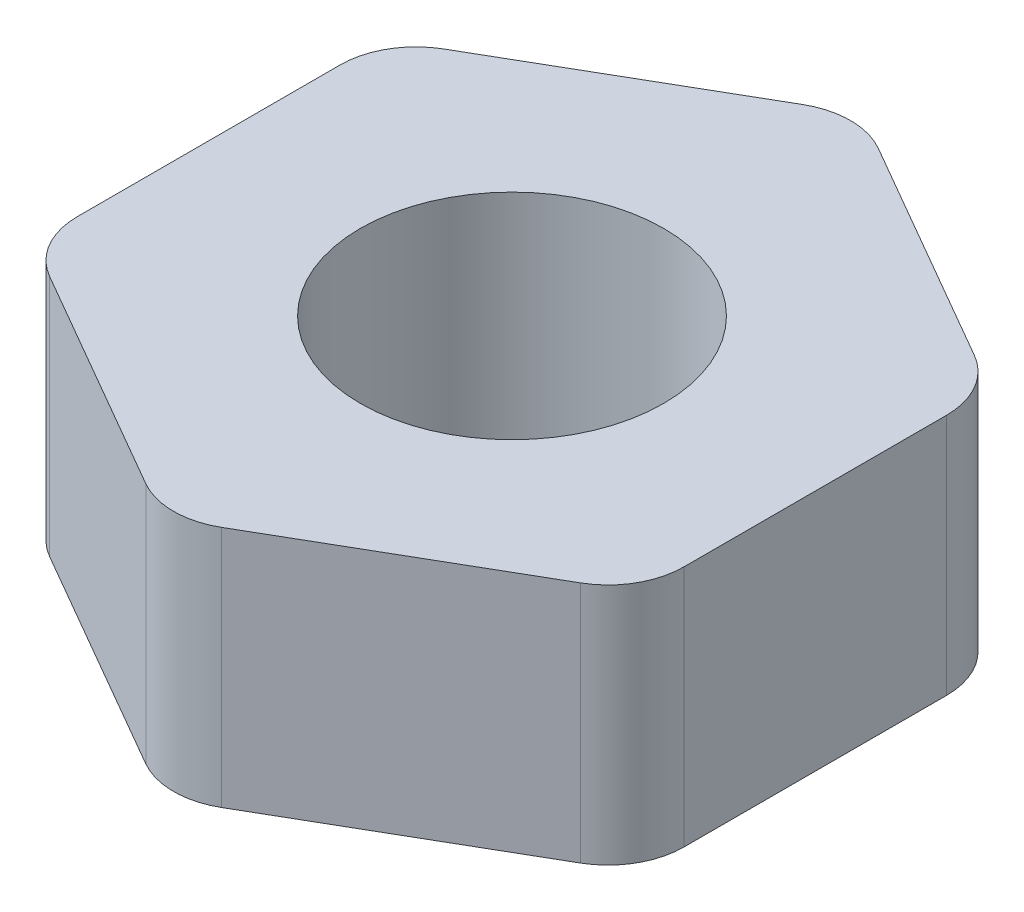
ISO-10303-21;
HEADER;
FILE_DESCRIPTION(('STEP AP214'),'2;1');
FILE_NAME('part.step','',(''),(''),'','','');
FILE_SCHEMA(('AUTOMOTIVE_DESIGN { 1 0 10303 214 1 1 1 1 }'));
ENDSEC;
DATA;
#1=APPLICATION_CONTEXT('core data for automotive mechanical design processes');
#2=APPLICATION_PROTOCOL_DEFINITION('international standard','automotive_design',2000,#1);
#3=PRODUCT_CONTEXT('',#1,'mechanical');
#4=PRODUCT('Part','Part','',(#3));
#5=PRODUCT_RELATED_PRODUCT_CATEGORY('part','',(#4));
#6=PRODUCT_DEFINITION_FORMATION('','',#4);
#7=PRODUCT_DEFINITION_CONTEXT('part definition',#1,'design');
#8=PRODUCT_DEFINITION('design','',#6,#7);
#9=PRODUCT_DEFINITION_SHAPE('','',#8);
#10=(LENGTH_UNIT() NAMED_UNIT(*) SI_UNIT(.MILLI.,.METRE.));
#11=(NAMED_UNIT(*) PLANE_ANGLE_UNIT() SI_UNIT($,.RADIAN.));
#12=(NAMED_UNIT(*) SI_UNIT($,.STERADIAN.) SOLID_ANGLE_UNIT());
#13=UNCERTAINTY_MEASURE_WITH_UNIT(LENGTH_MEASURE(1.E-05),#10,'distance_accuracy_value','');
#14=(GEOMETRIC_REPRESENTATION_CONTEXT(3) GLOBAL_UNCERTAINTY_ASSIGNED_CONTEXT((#13)) GLOBAL_UNIT_ASSIGNED_CONTEXT((#10,
#11,#12)) REPRESENTATION_CONTEXT('',''));
#15=CARTESIAN_POINT('',(0.,0.,0.));
#16=DIRECTION('',(0.,0.,1.));
#17=DIRECTION('',(1.,0.,0.));
#18=AXIS2_PLACEMENT_3D('',#15,#16,#17);
#19=CARTESIAN_POINT('',(0.,1.6,0.));
#20=DIRECTION('',(0.,1.,0.));
#21=DIRECTION('',(0.,0.,1.));
#22=AXIS2_PLACEMENT_3D('',#19,#20,#21);
#23=PLANE('',#22);
#24=DIRECTION('',(0.866025403784442,0.,0.499999999999995));
#25=VECTOR('',#24,1.);
#26=CARTESIAN_POINT('',(-2.,1.6,1.15470053837926));
#27=LINE('',#26,#25);
#28=CARTESIAN_POINT('',(-1.74999999999999,1.6,1.29903810567667));
#29=VERTEX_POINT('',#28);
#30=CARTESIAN_POINT('',(-0.249999999999985,1.6,2.1650635094611));
#31=VERTEX_POINT('',#30);
#32=EDGE_CURVE('E252',#29,#31,#27,.T.);
#33=ORIENTED_EDGE('',*,*,#32,.T.);
#34=CARTESIAN_POINT('',(0.,1.6,1.73205080756888));
#35=DIRECTION('',(0.,1.,0.));
#36=DIRECTION('',(0.,0.,1.));
#37=AXIS2_PLACEMENT_3D('',#34,#35,#36);
#38=CIRCLE('',#37,0.5);
#39=CARTESIAN_POINT('',(0.250000000000015,1.6,2.1650635094611));
#40=VERTEX_POINT('',#39);
#41=EDGE_CURVE('E212',#31,#40,#38,.T.);
#42=ORIENTED_EDGE('',*,*,#41,.T.);
#43=DIRECTION('',(0.866025403784435,0.,-0.500000000000007));
#44=VECTOR('',#43,1.);
#45=CARTESIAN_POINT('',(0.,1.6,2.3094010767585));
#46=LINE('',#45,#44);
#47=CARTESIAN_POINT('',(1.75000000000001,1.6,1.29903810567664));
#48=VERTEX_POINT('',#47);
#49=EDGE_CURVE('E157',#40,#48,#46,.T.);
#50=ORIENTED_EDGE('',*,*,#49,.T.);
#51=CARTESIAN_POINT('',(1.50000000000001,1.6,0.866025403784425));
#52=DIRECTION('',(0.,1.,0.));
#53=DIRECTION('',(0.,0.,1.));
#54=AXIS2_PLACEMENT_3D('',#51,#52,#53);
#55=CIRCLE('',#54,0.5);
#56=CARTESIAN_POINT('',(2.00000000000001,1.6,0.86602540378442));
#57=VERTEX_POINT('',#56);
#58=EDGE_CURVE('E68',#48,#57,#55,.T.);
#59=ORIENTED_EDGE('',*,*,#58,.T.);
#60=DIRECTION('',(0.,0.,-1.));
#61=VECTOR('',#60,1.);
#62=CARTESIAN_POINT('',(2.00000000000001,1.6,1.15470053837923));
#63=LINE('',#62,#61);
#64=CARTESIAN_POINT('',(1.99999999999999,1.6,-0.866025403784464));
#65=VERTEX_POINT('',#64);
#66=EDGE_CURVE('E178',#57,#65,#63,.T.);
#67=ORIENTED_EDGE('',*,*,#66,.T.);
#68=CARTESIAN_POINT('',(1.49999999999999,1.6,-0.866025403784459));
#69=DIRECTION('',(0.,1.,0.));
#70=DIRECTION('',(0.,0.,1.));
#71=AXIS2_PLACEMENT_3D('',#68,#69,#70);
#72=CIRCLE('',#71,0.5);
#73=CARTESIAN_POINT('',(1.74999999999999,1.6,-1.29903810567668));
#74=VERTEX_POINT('',#73);
#75=EDGE_CURVE('E204',#65,#74,#72,.T.);
#76=ORIENTED_EDGE('',*,*,#75,.T.);
#77=DIRECTION('',(-0.866025403784442,0.,-0.499999999999995));
#78=VECTOR('',#77,1.);
#79=CARTESIAN_POINT('',(1.99999999999999,1.6,-1.15470053837928));
#80=LINE('',#79,#78);
#81=CARTESIAN_POINT('',(0.249999999999999,1.6,-2.1650635094611));
#82=VERTEX_POINT('',#81);
#83=EDGE_CURVE('E171',#74,#82,#80,.T.);
#84=ORIENTED_EDGE('',*,*,#83,.T.);
#85=CARTESIAN_POINT('',(0.,1.6,-1.73205080756888));
#86=DIRECTION('',(0.,1.,0.));
#87=DIRECTION('',(0.,0.,1.));
#88=AXIS2_PLACEMENT_3D('',#85,#86,#87);
#89=CIRCLE('',#88,0.5);
#90=CARTESIAN_POINT('',(-0.249999999999999,1.6,-2.1650635094611));
#91=VERTEX_POINT('',#90);
#92=EDGE_CURVE('E207',#82,#91,#89,.T.);
#93=ORIENTED_EDGE('',*,*,#92,.T.);
#94=DIRECTION('',(-0.866025403784438,0.,0.500000000000001));
#95=VECTOR('',#94,1.);
#96=CARTESIAN_POINT('',(0.,1.6,-2.3094010767585));
#97=LINE('',#96,#95);
#98=CARTESIAN_POINT('',(-1.75,1.6,-1.29903810567665));
#99=VERTEX_POINT('',#98);
#100=EDGE_CURVE('E253',#91,#99,#97,.T.);
#101=ORIENTED_EDGE('',*,*,#100,.T.);
#102=CARTESIAN_POINT('',(-1.5,1.6,-0.866025403784436));
#103=DIRECTION('',(0.,1.,0.));
#104=DIRECTION('',(0.,0.,1.));
#105=AXIS2_PLACEMENT_3D('',#102,#103,#104);
#106=CIRCLE('',#105,0.5);
#107=CARTESIAN_POINT('',(-2.,1.6,-0.866025403784434));
#108=VERTEX_POINT('',#107);
#109=EDGE_CURVE('E201',#99,#108,#106,.T.);
#110=ORIENTED_EDGE('',*,*,#109,.T.);
#111=DIRECTION('',(0.,0.,1.));
#112=VECTOR('',#111,1.);
#113=CARTESIAN_POINT('',(-2.,1.6,-1.15470053837925));
#114=LINE('',#113,#112);
#115=CARTESIAN_POINT('',(-2.,1.6,0.866025403784448));
#116=VERTEX_POINT('',#115);
#117=EDGE_CURVE('E241',#108,#116,#114,.T.);
#118=ORIENTED_EDGE('',*,*,#117,.T.);
#119=CARTESIAN_POINT('',(-1.5,1.6,0.866025403784446));
#120=DIRECTION('',(0.,1.,0.));
#121=DIRECTION('',(0.,0.,1.));
#122=AXIS2_PLACEMENT_3D('',#119,#120,#121);
#123=CIRCLE('',#122,0.5);
#124=EDGE_CURVE('E198',#116,#29,#123,.T.);
#125=ORIENTED_EDGE('',*,*,#124,.T.);
#126=EDGE_LOOP('',(#33,#42,#50,#59,#67,#76,#84,#93,#101,#110,#118,#125));
#127=FACE_BOUND('',#126,.T.);
#128=CARTESIAN_POINT('',(0.,1.6,0.));
#129=DIRECTION('',(0.,1.,0.));
#130=DIRECTION('',(0.,0.,1.));
#131=AXIS2_PLACEMENT_3D('',#128,#129,#130);
#132=CIRCLE('',#131,1.);
#133=CARTESIAN_POINT('',(0.,1.6,1.));
#134=VERTEX_POINT('',#133);
#135=EDGE_CURVE('E269',#134,#134,#132,.T.);
#136=ORIENTED_EDGE('',*,*,#135,.F.);
#137=EDGE_LOOP('',(#136));
#138=FACE_BOUND('',#137,.T.);
#139=ADVANCED_FACE('F45',(#127,#138),#23,.T.);
#140=CARTESIAN_POINT('',(0.,0.,0.));
#141=DIRECTION('',(0.,1.,0.));
#142=DIRECTION('',(0.,0.,1.));
#143=AXIS2_PLACEMENT_3D('',#140,#141,#142);
#144=PLANE('',#143);
#145=DIRECTION('',(0.866025403784435,0.,-0.500000000000007));
#146=VECTOR('',#145,1.);
#147=CARTESIAN_POINT('',(0.,0.,2.3094010767585));
#148=LINE('',#147,#146);
#149=CARTESIAN_POINT('',(0.250000000000015,0.,2.1650635094611));
#150=VERTEX_POINT('',#149);
#151=CARTESIAN_POINT('',(1.75000000000001,0.,1.29903810567664));
#152=VERTEX_POINT('',#151);
#153=EDGE_CURVE('E155',#150,#152,#148,.T.);
#154=ORIENTED_EDGE('',*,*,#153,.F.);
#155=CARTESIAN_POINT('',(0.,0.,1.73205080756888));
#156=DIRECTION('',(0.,1.,0.));
#157=DIRECTION('',(0.,0.,1.));
#158=AXIS2_PLACEMENT_3D('',#155,#156,#157);
#159=CIRCLE('',#158,0.5);
#160=CARTESIAN_POINT('',(-0.249999999999985,0.,2.1650635094611));
#161=VERTEX_POINT('',#160);
#162=EDGE_CURVE('E137',#150,#161,#159,.F.);
#163=ORIENTED_EDGE('',*,*,#162,.T.);
#164=DIRECTION('',(0.866025403784442,0.,0.499999999999995));
#165=VECTOR('',#164,1.);
#166=CARTESIAN_POINT('',(-2.,0.,1.15470053837926));
#167=LINE('',#166,#165);
#168=CARTESIAN_POINT('',(-1.74999999999999,0.,1.29903810567667));
#169=VERTEX_POINT('',#168);
#170=EDGE_CURVE('E167',#169,#161,#167,.T.);
#171=ORIENTED_EDGE('',*,*,#170,.F.);
#172=CARTESIAN_POINT('',(-1.5,0.,0.866025403784446));
#173=DIRECTION('',(0.,1.,0.));
#174=DIRECTION('',(0.,0.,1.));
#175=AXIS2_PLACEMENT_3D('',#172,#173,#174);
#176=CIRCLE('',#175,0.5);
#177=CARTESIAN_POINT('',(-2.,0.,0.866025403784448));
#178=VERTEX_POINT('',#177);
#179=EDGE_CURVE('E159',#169,#178,#176,.F.);
#180=ORIENTED_EDGE('',*,*,#179,.T.);
#181=DIRECTION('',(0.,0.,1.));
#182=VECTOR('',#181,1.);
#183=CARTESIAN_POINT('',(-2.,0.,-1.15470053837925));
#184=LINE('',#183,#182);
#185=CARTESIAN_POINT('',(-2.,0.,-0.866025403784434));
#186=VERTEX_POINT('',#185);
#187=EDGE_CURVE('E173',#186,#178,#184,.T.);
#188=ORIENTED_EDGE('',*,*,#187,.F.);
#189=CARTESIAN_POINT('',(-1.5,0.,-0.866025403784436));
#190=DIRECTION('',(0.,1.,0.));
#191=DIRECTION('',(0.,0.,1.));
#192=AXIS2_PLACEMENT_3D('',#189,#190,#191);
#193=CIRCLE('',#192,0.5);
#194=CARTESIAN_POINT('',(-1.75,0.,-1.29903810567665));
#195=VERTEX_POINT('',#194);
#196=EDGE_CURVE('E182',#186,#195,#193,.F.);
#197=ORIENTED_EDGE('',*,*,#196,.T.);
#198=DIRECTION('',(-0.866025403784438,0.,0.500000000000001));
#199=VECTOR('',#198,1.);
#200=CARTESIAN_POINT('',(0.,0.,-2.3094010767585));
#201=LINE('',#200,#199);
#202=CARTESIAN_POINT('',(-0.249999999999999,0.,-2.1650635094611));
#203=VERTEX_POINT('',#202);
#204=EDGE_CURVE('E261',#203,#195,#201,.T.);
#205=ORIENTED_EDGE('',*,*,#204,.F.);
#206=CARTESIAN_POINT('',(0.,0.,-1.73205080756888));
#207=DIRECTION('',(0.,1.,0.));
#208=DIRECTION('',(0.,0.,1.));
#209=AXIS2_PLACEMENT_3D('',#206,#207,#208);
#210=CIRCLE('',#209,0.5);
#211=CARTESIAN_POINT('',(0.249999999999999,0.,-2.1650635094611));
#212=VERTEX_POINT('',#211);
#213=EDGE_CURVE('E188',#203,#212,#210,.F.);
#214=ORIENTED_EDGE('',*,*,#213,.T.);
#215=DIRECTION('',(-0.866025403784442,0.,-0.499999999999995));
#216=VECTOR('',#215,1.);
#217=CARTESIAN_POINT('',(1.99999999999999,0.,-1.15470053837928));
#218=LINE('',#217,#216);
#219=CARTESIAN_POINT('',(1.74999999999999,0.,-1.29903810567668));
#220=VERTEX_POINT('',#219);
#221=EDGE_CURVE('E263',#220,#212,#218,.T.);
#222=ORIENTED_EDGE('',*,*,#221,.F.);
#223=CARTESIAN_POINT('',(1.49999999999999,0.,-0.866025403784459));
#224=DIRECTION('',(0.,1.,0.));
#225=DIRECTION('',(0.,0.,1.));
#226=AXIS2_PLACEMENT_3D('',#223,#224,#225);
#227=CIRCLE('',#226,0.5);
#228=CARTESIAN_POINT('',(1.99999999999999,0.,-0.866025403784464));
#229=VERTEX_POINT('',#228);
#230=EDGE_CURVE('E185',#220,#229,#227,.F.);
#231=ORIENTED_EDGE('',*,*,#230,.T.);
#232=DIRECTION('',(0.,0.,-1.));
#233=VECTOR('',#232,1.);
#234=CARTESIAN_POINT('',(2.00000000000001,0.,1.15470053837923));
#235=LINE('',#234,#233);
#236=CARTESIAN_POINT('',(2.00000000000001,0.,0.86602540378442));
#237=VERTEX_POINT('',#236);
#238=EDGE_CURVE('E166',#237,#229,#235,.T.);
#239=ORIENTED_EDGE('',*,*,#238,.F.);
#240=CARTESIAN_POINT('',(1.50000000000001,0.,0.866025403784425));
#241=DIRECTION('',(0.,1.,0.));
#242=DIRECTION('',(0.,0.,1.));
#243=AXIS2_PLACEMENT_3D('',#240,#241,#242);
#244=CIRCLE('',#243,0.5);
#245=EDGE_CURVE('E149',#237,#152,#244,.F.);
#246=ORIENTED_EDGE('',*,*,#245,.T.);
#247=EDGE_LOOP('',(#154,#163,#171,#180,#188,#197,#205,#214,#222,#231,#239,#246));
#248=FACE_BOUND('',#247,.T.);
#249=CARTESIAN_POINT('',(0.,0.,0.));
#250=DIRECTION('',(0.,1.,0.));
#251=DIRECTION('',(0.,0.,1.));
#252=AXIS2_PLACEMENT_3D('',#249,#250,#251);
#253=CIRCLE('',#252,1.);
#254=CARTESIAN_POINT('',(0.,0.,1.));
#255=VERTEX_POINT('',#254);
#256=EDGE_CURVE('E281',#255,#255,#253,.T.);
#257=ORIENTED_EDGE('',*,*,#256,.T.);
#258=EDGE_LOOP('',(#257));
#259=FACE_BOUND('',#258,.T.);
#260=ADVANCED_FACE('F162',(#248,#259),#144,.F.);
#261=CARTESIAN_POINT('',(1.99999999999999,1.6,-1.15470053837928));
#262=DIRECTION('',(-0.499999999999995,0.,0.866025403784441));
#263=DIRECTION('',(0.866025403784442,0.,0.499999999999995));
#264=AXIS2_PLACEMENT_3D('',#261,#262,#263);
#265=PLANE('',#264);
#266=ORIENTED_EDGE('',*,*,#221,.T.);
#267=DIRECTION('',(0.,-1.,0.));
#268=VECTOR('',#267,1.);
#269=CARTESIAN_POINT('',(0.25,1.6,-2.1650635094611));
#270=LINE('',#269,#268);
#271=EDGE_CURVE('E232',#212,#82,#270,.F.);
#272=ORIENTED_EDGE('',*,*,#271,.T.);
#273=ORIENTED_EDGE('',*,*,#83,.F.);
#274=DIRECTION('',(0.,-1.,0.));
#275=VECTOR('',#274,1.);
#276=CARTESIAN_POINT('',(1.74999999999999,1.6,-1.29903810567668));
#277=LINE('',#276,#275);
#278=EDGE_CURVE('E228',#74,#220,#277,.T.);
#279=ORIENTED_EDGE('',*,*,#278,.T.);
#280=EDGE_LOOP('',(#266,#272,#273,#279));
#281=FACE_BOUND('',#280,.T.);
#282=ADVANCED_FACE('F297',(#281),#265,.F.);
#283=CARTESIAN_POINT('',(0.,1.6,-2.3094010767585));
#284=DIRECTION('',(0.500000000000001,0.,0.866025403784438));
#285=DIRECTION('',(0.866025403784438,0.,-0.500000000000001));
#286=AXIS2_PLACEMENT_3D('',#283,#284,#285);
#287=PLANE('',#286);
#288=ORIENTED_EDGE('',*,*,#100,.F.);
#289=DIRECTION('',(0.,-1.,0.));
#290=VECTOR('',#289,1.);
#291=CARTESIAN_POINT('',(-0.249999999999999,1.6,-2.1650635094611));
#292=LINE('',#291,#290);
#293=EDGE_CURVE('E224',#91,#203,#292,.T.);
#294=ORIENTED_EDGE('',*,*,#293,.T.);
#295=ORIENTED_EDGE('',*,*,#204,.T.);
#296=DIRECTION('',(0.,-1.,0.));
#297=VECTOR('',#296,1.);
#298=CARTESIAN_POINT('',(-1.75,1.6,-1.29903810567665));
#299=LINE('',#298,#297);
#300=EDGE_CURVE('E221',#195,#99,#299,.F.);
#301=ORIENTED_EDGE('',*,*,#300,.T.);
#302=EDGE_LOOP('',(#288,#294,#295,#301));
#303=FACE_BOUND('',#302,.T.);
#304=ADVANCED_FACE('F310',(#303),#287,.F.);
#305=CARTESIAN_POINT('',(-2.,1.6,-1.15470053837925));
#306=DIRECTION('',(1.,0.,0.));
#307=DIRECTION('',(0.,0.,-1.));
#308=AXIS2_PLACEMENT_3D('',#305,#306,#307);
#309=PLANE('',#308);
#310=ORIENTED_EDGE('',*,*,#117,.F.);
#311=DIRECTION('',(0.,-1.,0.));
#312=VECTOR('',#311,1.);
#313=CARTESIAN_POINT('',(-2.,1.6,-0.866025403784434));
#314=LINE('',#313,#312);
#315=EDGE_CURVE('E11',#108,#186,#314,.T.);
#316=ORIENTED_EDGE('',*,*,#315,.T.);
#317=ORIENTED_EDGE('',*,*,#187,.T.);
#318=DIRECTION('',(0.,-1.,0.));
#319=VECTOR('',#318,1.);
#320=CARTESIAN_POINT('',(-2.,1.6,0.866025403784448));
#321=LINE('',#320,#319);
#322=EDGE_CURVE('E54',#178,#116,#321,.F.);
#323=ORIENTED_EDGE('',*,*,#322,.T.);
#324=EDGE_LOOP('',(#310,#316,#317,#323));
#325=FACE_BOUND('',#324,.T.);
#326=ADVANCED_FACE('F240',(#325),#309,.F.);
#327=CARTESIAN_POINT('',(-2.,1.6,1.15470053837926));
#328=DIRECTION('',(0.499999999999995,0.,-0.866025403784442));
#329=DIRECTION('',(-0.866025403784442,0.,-0.499999999999995));
#330=AXIS2_PLACEMENT_3D('',#327,#328,#329);
#331=PLANE('',#330);
#332=ORIENTED_EDGE('',*,*,#170,.T.);
#333=DIRECTION('',(0.,-1.,0.));
#334=VECTOR('',#333,1.);
#335=CARTESIAN_POINT('',(-0.249999999999986,1.6,2.1650635094611));
#336=LINE('',#335,#334);
#337=EDGE_CURVE('E142',#161,#31,#336,.F.);
#338=ORIENTED_EDGE('',*,*,#337,.T.);
#339=ORIENTED_EDGE('',*,*,#32,.F.);
#340=DIRECTION('',(0.,-1.,0.));
#341=VECTOR('',#340,1.);
#342=CARTESIAN_POINT('',(-1.74999999999999,1.6,1.29903810567667));
#343=LINE('',#342,#341);
#344=EDGE_CURVE('E148',#29,#169,#343,.T.);
#345=ORIENTED_EDGE('',*,*,#344,.T.);
#346=EDGE_LOOP('',(#332,#338,#339,#345));
#347=FACE_BOUND('',#346,.T.);
#348=ADVANCED_FACE('F257',(#347),#331,.F.);
#349=CARTESIAN_POINT('',(0.,1.6,2.3094010767585));
#350=DIRECTION('',(-0.500000000000007,0.,-0.866025403784435));
#351=DIRECTION('',(-0.866025403784435,0.,0.500000000000007));
#352=AXIS2_PLACEMENT_3D('',#349,#350,#351);
#353=PLANE('',#352);
#354=ORIENTED_EDGE('',*,*,#49,.F.);
#355=DIRECTION('',(0.,-1.,0.));
#356=VECTOR('',#355,1.);
#357=CARTESIAN_POINT('',(0.250000000000015,1.6,2.1650635094611));
#358=LINE('',#357,#356);
#359=EDGE_CURVE('E141',#40,#150,#358,.T.);
#360=ORIENTED_EDGE('',*,*,#359,.T.);
#361=ORIENTED_EDGE('',*,*,#153,.T.);
#362=DIRECTION('',(0.,-1.,0.));
#363=VECTOR('',#362,1.);
#364=CARTESIAN_POINT('',(1.75000000000001,1.6,1.29903810567664));
#365=LINE('',#364,#363);
#366=EDGE_CURVE('E160',#152,#48,#365,.F.);
#367=ORIENTED_EDGE('',*,*,#366,.T.);
#368=EDGE_LOOP('',(#354,#360,#361,#367));
#369=FACE_BOUND('',#368,.T.);
#370=ADVANCED_FACE('F154',(#369),#353,.F.);
#371=CARTESIAN_POINT('',(2.00000000000001,1.6,1.15470053837923));
#372=DIRECTION('',(-1.,0.,0.));
#373=DIRECTION('',(0.,0.,1.));
#374=AXIS2_PLACEMENT_3D('',#371,#372,#373);
#375=PLANE('',#374);
#376=ORIENTED_EDGE('',*,*,#66,.F.);
#377=DIRECTION('',(0.,-1.,0.));
#378=VECTOR('',#377,1.);
#379=CARTESIAN_POINT('',(2.00000000000001,1.6,0.86602540378442));
#380=LINE('',#379,#378);
#381=EDGE_CURVE('E217',#57,#237,#380,.T.);
#382=ORIENTED_EDGE('',*,*,#381,.T.);
#383=ORIENTED_EDGE('',*,*,#238,.T.);
#384=DIRECTION('',(0.,-1.,0.));
#385=VECTOR('',#384,1.);
#386=CARTESIAN_POINT('',(1.99999999999999,1.6,-0.866025403784464));
#387=LINE('',#386,#385);
#388=EDGE_CURVE('E61',#229,#65,#387,.F.);
#389=ORIENTED_EDGE('',*,*,#388,.T.);
#390=EDGE_LOOP('',(#376,#382,#383,#389));
#391=FACE_BOUND('',#390,.T.);
#392=ADVANCED_FACE('F301',(#391),#375,.F.);
#393=CARTESIAN_POINT('',(0.,1.6,0.));
#394=DIRECTION('',(0.,-1.,0.));
#395=DIRECTION('',(0.,0.,-1.));
#396=AXIS2_PLACEMENT_3D('',#393,#394,#395);
#397=CYLINDRICAL_SURFACE('',#396,1.);
#398=ORIENTED_EDGE('',*,*,#135,.T.);
#399=EDGE_LOOP('',(#398));
#400=FACE_BOUND('',#399,.T.);
#401=ORIENTED_EDGE('',*,*,#256,.F.);
#402=EDGE_LOOP('',(#401));
#403=FACE_BOUND('',#402,.T.);
#404=ADVANCED_FACE('F289',(#400,#403),#397,.F.);
#405=CARTESIAN_POINT('',(0.,1.6,1.73205080756888));
#406=DIRECTION('',(0.,-1.,0.));
#407=DIRECTION('',(0.,0.,-1.));
#408=AXIS2_PLACEMENT_3D('',#405,#406,#407);
#409=CYLINDRICAL_SURFACE('',#408,0.5);
#410=ORIENTED_EDGE('',*,*,#41,.F.);
#411=ORIENTED_EDGE('',*,*,#337,.F.);
#412=ORIENTED_EDGE('',*,*,#162,.F.);
#413=ORIENTED_EDGE('',*,*,#359,.F.);
#414=EDGE_LOOP('',(#410,#411,#412,#413));
#415=FACE_BOUND('',#414,.T.);
#416=ADVANCED_FACE('F140',(#415),#409,.T.);
#417=CARTESIAN_POINT('',(1.50000000000001,1.6,0.866025403784425));
#418=DIRECTION('',(0.,-1.,0.));
#419=DIRECTION('',(0.,0.,-1.));
#420=AXIS2_PLACEMENT_3D('',#417,#418,#419);
#421=CYLINDRICAL_SURFACE('',#420,0.5);
#422=ORIENTED_EDGE('',*,*,#58,.F.);
#423=ORIENTED_EDGE('',*,*,#366,.F.);
#424=ORIENTED_EDGE('',*,*,#245,.F.);
#425=ORIENTED_EDGE('',*,*,#381,.F.);
#426=EDGE_LOOP('',(#422,#423,#424,#425));
#427=FACE_BOUND('',#426,.T.);
#428=ADVANCED_FACE('F319',(#427),#421,.T.);
#429=CARTESIAN_POINT('',(0.,1.6,-1.73205080756888));
#430=DIRECTION('',(0.,-1.,0.));
#431=DIRECTION('',(0.,0.,-1.));
#432=AXIS2_PLACEMENT_3D('',#429,#430,#431);
#433=CYLINDRICAL_SURFACE('',#432,0.5);
#434=ORIENTED_EDGE('',*,*,#92,.F.);
#435=ORIENTED_EDGE('',*,*,#271,.F.);
#436=ORIENTED_EDGE('',*,*,#213,.F.);
#437=ORIENTED_EDGE('',*,*,#293,.F.);
#438=EDGE_LOOP('',(#434,#435,#436,#437));
#439=FACE_BOUND('',#438,.T.);
#440=ADVANCED_FACE('F322',(#439),#433,.T.);
#441=CARTESIAN_POINT('',(1.49999999999999,1.6,-0.866025403784459));
#442=DIRECTION('',(0.,-1.,0.));
#443=DIRECTION('',(0.,0.,-1.));
#444=AXIS2_PLACEMENT_3D('',#441,#442,#443);
#445=CYLINDRICAL_SURFACE('',#444,0.5);
#446=ORIENTED_EDGE('',*,*,#75,.F.);
#447=ORIENTED_EDGE('',*,*,#388,.F.);
#448=ORIENTED_EDGE('',*,*,#230,.F.);
#449=ORIENTED_EDGE('',*,*,#278,.F.);
#450=EDGE_LOOP('',(#446,#447,#448,#449));
#451=FACE_BOUND('',#450,.T.);
#452=ADVANCED_FACE('F326',(#451),#445,.T.);
#453=CARTESIAN_POINT('',(-1.5,1.6,-0.866025403784436));
#454=DIRECTION('',(0.,-1.,0.));
#455=DIRECTION('',(0.,0.,-1.));
#456=AXIS2_PLACEMENT_3D('',#453,#454,#455);
#457=CYLINDRICAL_SURFACE('',#456,0.5);
#458=ORIENTED_EDGE('',*,*,#109,.F.);
#459=ORIENTED_EDGE('',*,*,#300,.F.);
#460=ORIENTED_EDGE('',*,*,#196,.F.);
#461=ORIENTED_EDGE('',*,*,#315,.F.);
#462=EDGE_LOOP('',(#458,#459,#460,#461));
#463=FACE_BOUND('',#462,.T.);
#464=ADVANCED_FACE('F329',(#463),#457,.T.);
#465=CARTESIAN_POINT('',(-1.5,1.6,0.866025403784446));
#466=DIRECTION('',(0.,-1.,0.));
#467=DIRECTION('',(0.,0.,-1.));
#468=AXIS2_PLACEMENT_3D('',#465,#466,#467);
#469=CYLINDRICAL_SURFACE('',#468,0.5);
#470=ORIENTED_EDGE('',*,*,#124,.F.);
#471=ORIENTED_EDGE('',*,*,#322,.F.);
#472=ORIENTED_EDGE('',*,*,#179,.F.);
#473=ORIENTED_EDGE('',*,*,#344,.F.);
#474=EDGE_LOOP('',(#470,#471,#472,#473));
#475=FACE_BOUND('',#474,.T.);
#476=ADVANCED_FACE('F47',(#475),#469,.T.);
#477=CLOSED_SHELL('',(#139,#260,#282,#304,#326,#348,#370,#392,#404,#416,#428,#440,#452,#464,#476));
#478=MANIFOLD_SOLID_BREP('B2',#477);
#479=ADVANCED_BREP_SHAPE_REPRESENTATION('',(#18,#478),#14);
#480=SHAPE_DEFINITION_REPRESENTATION(#9,#479);
ENDSEC;
END-ISO-10303-21;
